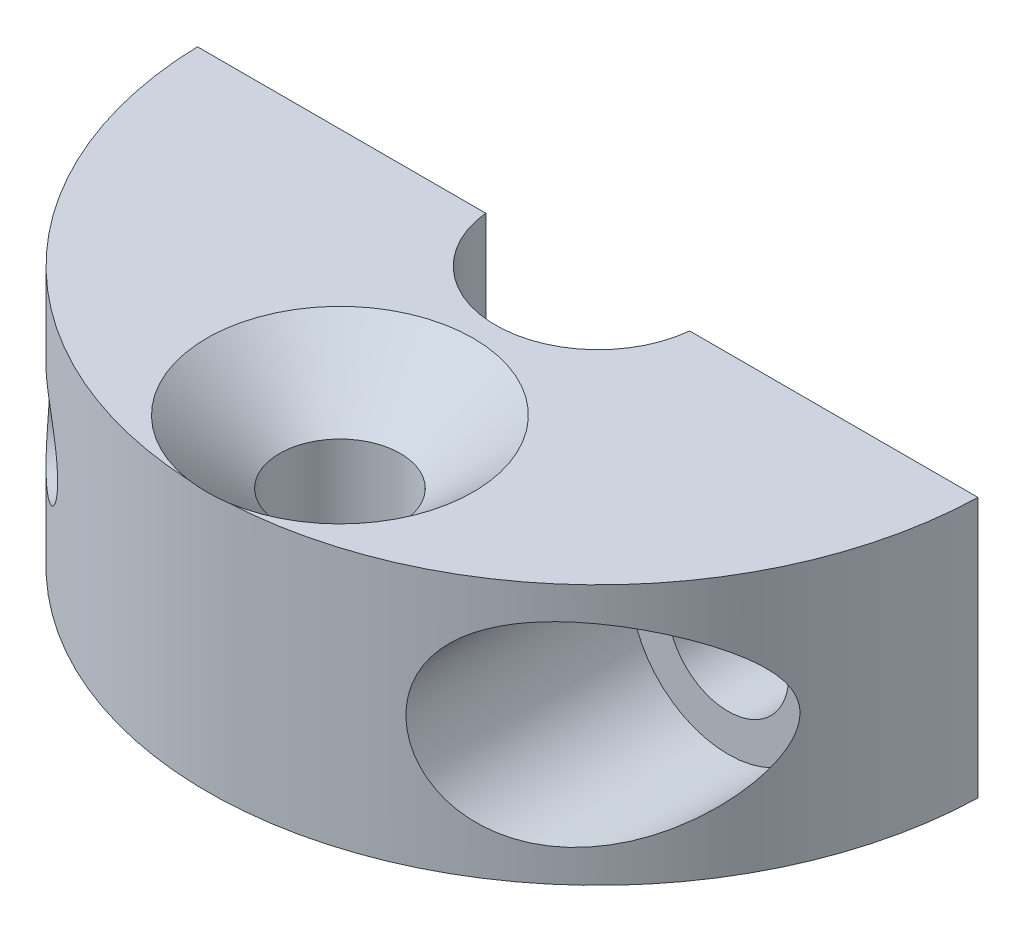
ISO-10303-21;
HEADER;
FILE_DESCRIPTION(('STEP AP214'),'2;1');
FILE_NAME('part.step','',(''),(''),'','','');
FILE_SCHEMA(('AUTOMOTIVE_DESIGN { 1 0 10303 214 1 1 1 1 }'));
ENDSEC;
DATA;
#1=APPLICATION_CONTEXT('core data for automotive mechanical design processes');
#2=APPLICATION_PROTOCOL_DEFINITION('international standard','automotive_design',2000,#1);
#3=PRODUCT_CONTEXT('',#1,'mechanical');
#4=PRODUCT('Part','Part','',(#3));
#5=PRODUCT_RELATED_PRODUCT_CATEGORY('part','',(#4));
#6=PRODUCT_DEFINITION_FORMATION('','',#4);
#7=PRODUCT_DEFINITION_CONTEXT('part definition',#1,'design');
#8=PRODUCT_DEFINITION('design','',#6,#7);
#9=PRODUCT_DEFINITION_SHAPE('','',#8);
#10=(LENGTH_UNIT() NAMED_UNIT(*) SI_UNIT(.MILLI.,.METRE.));
#11=(NAMED_UNIT(*) PLANE_ANGLE_UNIT() SI_UNIT($,.RADIAN.));
#12=(NAMED_UNIT(*) SI_UNIT($,.STERADIAN.) SOLID_ANGLE_UNIT());
#13=UNCERTAINTY_MEASURE_WITH_UNIT(LENGTH_MEASURE(1.E-05),#10,'distance_accuracy_value','');
#14=(GEOMETRIC_REPRESENTATION_CONTEXT(3) GLOBAL_UNCERTAINTY_ASSIGNED_CONTEXT((#13)) GLOBAL_UNIT_ASSIGNED_CONTEXT((#10,
#11,#12)) REPRESENTATION_CONTEXT('',''));
#15=CARTESIAN_POINT('',(0.,0.,0.));
#16=DIRECTION('',(0.,0.,1.));
#17=DIRECTION('',(1.,0.,0.));
#18=AXIS2_PLACEMENT_3D('',#15,#16,#17);
#19=CARTESIAN_POINT('',(0.,6.35,0.254));
#20=DIRECTION('',(0.,0.,-1.));
#21=DIRECTION('',(-1.,0.,0.));
#22=AXIS2_PLACEMENT_3D('',#19,#20,#21);
#23=PLANE('',#22);
#24=CARTESIAN_POINT('',(-6.35,3.175,0.253999999999998));
#25=DIRECTION('',(0.,0.,-1.));
#26=DIRECTION('',(-1.,0.,0.));
#27=AXIS2_PLACEMENT_3D('',#24,#25,#26);
#28=CIRCLE('',#27,1.13029999999999);
#29=CARTESIAN_POINT('',(-7.48029999999999,3.175,0.253999999999998));
#30=VERTEX_POINT('',#29);
#31=EDGE_CURVE('E129',#30,#30,#28,.T.);
#32=ORIENTED_EDGE('',*,*,#31,.F.);
#33=EDGE_LOOP('',(#32));
#34=FACE_BOUND('',#33,.T.);
#35=DIRECTION('',(1.,0.,0.));
#36=VECTOR('',#35,1.);
#37=CARTESIAN_POINT('',(0.,0.,0.254));
#38=LINE('',#37,#36);
#39=CARTESIAN_POINT('',(-9.52161273104509,0.,0.254));
#40=VERTEX_POINT('',#39);
#41=CARTESIAN_POINT('',(-2.48706332850613,0.,0.254));
#42=VERTEX_POINT('',#41);
#43=EDGE_CURVE('E88',#40,#42,#38,.T.);
#44=ORIENTED_EDGE('',*,*,#43,.F.);
#45=DIRECTION('',(0.,-1.,0.));
#46=VECTOR('',#45,1.);
#47=CARTESIAN_POINT('',(-9.52161273104509,6.35,0.254));
#48=LINE('',#47,#46);
#49=CARTESIAN_POINT('',(-9.52161273104509,6.35,0.254));
#50=VERTEX_POINT('',#49);
#51=EDGE_CURVE('E83',#50,#40,#48,.T.);
#52=ORIENTED_EDGE('',*,*,#51,.F.);
#53=DIRECTION('',(1.,0.,0.));
#54=VECTOR('',#53,1.);
#55=CARTESIAN_POINT('',(0.,6.35,0.254));
#56=LINE('',#55,#54);
#57=CARTESIAN_POINT('',(-2.48706332850613,6.35,0.254));
#58=VERTEX_POINT('',#57);
#59=EDGE_CURVE('E85',#50,#58,#56,.T.);
#60=ORIENTED_EDGE('',*,*,#59,.T.);
#61=DIRECTION('',(0.,-1.,0.));
#62=VECTOR('',#61,1.);
#63=CARTESIAN_POINT('',(-2.48706332850613,6.35,0.254));
#64=LINE('',#63,#62);
#65=EDGE_CURVE('E112',#58,#42,#64,.T.);
#66=ORIENTED_EDGE('',*,*,#65,.T.);
#67=EDGE_LOOP('',(#44,#52,#60,#66));
#68=FACE_BOUND('',#67,.T.);
#69=ADVANCED_FACE('F34',(#34,#68),#23,.T.);
#70=CARTESIAN_POINT('',(0.,6.35,0.));
#71=DIRECTION('',(0.,-1.,0.));
#72=DIRECTION('',(0.,0.,-1.));
#73=AXIS2_PLACEMENT_3D('',#70,#71,#72);
#74=CYLINDRICAL_SURFACE('',#73,9.525);
#75=CARTESIAN_POINT('',(8.73125,3.175,3.80669127162947));
#76=CARTESIAN_POINT('',(8.73124585906262,3.11380274599718,3.80670249167699));
#77=CARTESIAN_POINT('',(8.72886012086863,3.05255860385612,3.8121871287378));
#78=CARTESIAN_POINT('',(8.71961189124467,2.93217450298505,3.83329025284248));
#79=CARTESIAN_POINT('',(8.71274014123032,2.87303916335728,3.84892969781852));
#80=CARTESIAN_POINT('',(8.69247941509186,2.74031642023187,3.89451082973297));
#81=CARTESIAN_POINT('',(8.67772651086615,2.66797118569365,3.9273913444508));
#82=CARTESIAN_POINT('',(8.64326647717071,2.52971364812622,4.00265921990601));
#83=CARTESIAN_POINT('',(8.62354606962987,2.46381925430396,4.04507202705856));
#84=CARTESIAN_POINT('',(8.58194034360545,2.34279933963332,4.13256522289036));
#85=CARTESIAN_POINT('',(8.56033976584612,2.28723517281762,4.17718676075458));
#86=CARTESIAN_POINT('',(8.51438406626409,2.18042647889881,4.27007942896299));
#87=CARTESIAN_POINT('',(8.49002654420177,2.12918578467373,4.31835372714993));
#88=CARTESIAN_POINT('',(8.43885987449998,2.03039737946162,4.41750940373829));
#89=CARTESIAN_POINT('',(8.41204591082429,1.98285727631924,4.46839581367708));
#90=CARTESIAN_POINT('',(8.35621302061041,1.89112262737687,4.57195774228212));
#91=CARTESIAN_POINT('',(8.32719330508891,1.84692929008482,4.62463389736762));
#92=CARTESIAN_POINT('',(8.2404166552828,1.72365201522633,4.77854204058472));
#93=CARTESIAN_POINT('',(8.1800128267769,1.64841149762572,4.88137696894751));
#94=CARTESIAN_POINT('',(8.05235218932252,1.50724919354207,5.08922110982695));
#95=CARTESIAN_POINT('',(7.98509022960663,1.44133450121234,5.1942319086533));
#96=CARTESIAN_POINT('',(7.84387363125929,1.31826281768241,5.40512670932795));
#97=CARTESIAN_POINT('',(7.769910458926,1.26111725014447,5.51101166397504));
#98=CARTESIAN_POINT('',(7.61551313897524,1.15570256607707,5.72247580502464));
#99=CARTESIAN_POINT('',(7.5350791861827,1.10743318244348,5.82805500053399));
#100=CARTESIAN_POINT('',(7.36503906365976,1.01871833034591,6.04161207806623));
#101=CARTESIAN_POINT('',(7.27521448090222,0.978593297000625,6.14955005748118));
#102=CARTESIAN_POINT('',(7.08900687686002,0.909145670385695,6.36330911966715));
#103=CARTESIAN_POINT('',(6.99262205305856,0.879826060365894,6.46912961020983));
#104=CARTESIAN_POINT('',(6.79405082165952,0.833305552602271,6.67735856479362));
#105=CARTESIAN_POINT('',(6.69188371868746,0.816066635450057,6.77977675807698));
#106=CARTESIAN_POINT('',(6.48230300007768,0.795098780233277,6.98043051873497));
#107=CARTESIAN_POINT('',(6.37489340880526,0.791359639451975,7.07866918934792));
#108=CARTESIAN_POINT('',(6.13197538862243,0.799997948644437,7.29080237684964));
#109=CARTESIAN_POINT('',(5.99545094973052,0.816071247504053,7.40343391903308));
#110=CARTESIAN_POINT('',(5.71986642007338,0.874335798460531,7.61834490877518));
#111=CARTESIAN_POINT('',(5.58080983450057,0.916493268147632,7.72063754752956));
#112=CARTESIAN_POINT('',(5.32740714199558,1.02085690299249,7.89710842656864));
#113=CARTESIAN_POINT('',(5.212641016834,1.07882078235369,7.97317226827228));
#114=CARTESIAN_POINT('',(4.98950349468955,1.21629028772849,8.11467244069007));
#115=CARTESIAN_POINT('',(4.88113052860474,1.29579060094561,8.18011138608775));
#116=CARTESIAN_POINT('',(4.67530866171848,1.47657997420088,8.29948117455004));
#117=CARTESIAN_POINT('',(4.57793400105917,1.57800503549653,8.35333579853252));
#118=CARTESIAN_POINT('',(4.40049844184197,1.80023770574852,8.44815969502052));
#119=CARTESIAN_POINT('',(4.32042877505943,1.92103544450288,8.48913549786795));
#120=CARTESIAN_POINT('',(4.19061716402563,2.16305355555541,8.55388859931293));
#121=CARTESIAN_POINT('',(4.13842604105973,2.28257850762935,8.57911517651567));
#122=CARTESIAN_POINT('',(4.05401892692662,2.53010112829094,8.61932502802954));
#123=CARTESIAN_POINT('',(4.02179474444212,2.6580952985495,8.63431250312991));
#124=CARTESIAN_POINT('',(3.98030162898478,2.91012756038926,8.65351431952956));
#125=CARTESIAN_POINT('',(3.9697072091351,3.03390221400917,8.65835127039265));
#126=CARTESIAN_POINT('',(3.96791765661135,3.28161106762906,8.65917197988703));
#127=CARTESIAN_POINT('',(3.97671907136452,3.40554523530985,8.65515731415811));
#128=CARTESIAN_POINT('',(4.0130215187815,3.64792226994344,8.63838326555925));
#129=CARTESIAN_POINT('',(4.04021217484417,3.76642196060128,8.62576900020099));
#130=CARTESIAN_POINT('',(4.11179310891203,3.99678372543352,8.59187630600988));
#131=CARTESIAN_POINT('',(4.15618287617765,4.10864599659698,8.57059813445679));
#132=CARTESIAN_POINT('',(4.26086419795659,4.32407395429554,8.51904254560431));
#133=CARTESIAN_POINT('',(4.32133412902925,4.42752842960967,8.48866366377713));
#134=CARTESIAN_POINT('',(4.45533724770527,4.62226763054796,8.41910199510069));
#135=CARTESIAN_POINT('',(4.52887201628935,4.71355088098503,8.37991814260663));
#136=CARTESIAN_POINT('',(4.68967520458576,4.88620623020625,8.29104170582099));
#137=CARTESIAN_POINT('',(4.77742189145047,4.96692366723649,8.24094653064745));
#138=CARTESIAN_POINT('',(4.96044679236488,5.11231007852109,8.13209269583887));
#139=CARTESIAN_POINT('',(5.05572697275969,5.17697484445427,8.07333177083856));
#140=CARTESIAN_POINT('',(5.26043691729229,5.29599288241576,7.94164236856519));
#141=CARTESIAN_POINT('',(5.37032121744672,5.3486331353757,7.86788123443396));
#142=CARTESIAN_POINT('',(5.59162261419243,5.43539066226963,7.7121793386027));
#143=CARTESIAN_POINT('',(5.70304085466794,5.46949324892478,7.63023215181272));
#144=CARTESIAN_POINT('',(5.89509506245812,5.51388630770408,7.48224930743032));
#145=CARTESIAN_POINT('',(5.97605793436485,5.5280933617614,7.41775772611152));
#146=CARTESIAN_POINT('',(6.13645657545348,5.54803264694833,7.28562597510152));
#147=CARTESIAN_POINT('',(6.21589177934332,5.55376179831821,7.21798467041255));
#148=CARTESIAN_POINT('',(6.45104510570492,5.55927014275432,7.01092802191453));
#149=CARTESIAN_POINT('',(6.60356319311729,5.54736016486058,6.86741666472369));
#150=CARTESIAN_POINT('',(6.84688207474141,5.50590938017747,6.62305380134368));
#151=CARTESIAN_POINT('',(6.94111904288746,5.48368843383567,6.5241785701631));
#152=CARTESIAN_POINT('',(7.1239281214786,5.42899197284371,6.32404886699402));
#153=CARTESIAN_POINT('',(7.21250100782499,5.39651786636966,6.22279472349348));
#154=CARTESIAN_POINT('',(7.38404496573302,5.322065410151,6.01825695280595));
#155=CARTESIAN_POINT('',(7.46698946263312,5.28004556448929,5.91496631849497));
#156=CARTESIAN_POINT('',(7.62666648638895,5.18721292272886,5.70760009762724));
#157=CARTESIAN_POINT('',(7.70340074392202,5.13640258884557,5.6035247386583));
#158=CARTESIAN_POINT('',(7.85225788367841,5.0249783674519,5.39301985487657));
#159=CARTESIAN_POINT('',(7.92423346499236,4.96416528440563,5.2865914339636));
#160=CARTESIAN_POINT('',(8.06147425772619,4.83337456723039,5.0748586875616));
#161=CARTESIAN_POINT('',(8.12673302240567,4.76338827250192,4.96955552735754));
#162=CARTESIAN_POINT('',(8.24975947065343,4.61395533302383,4.76250463073511));
#163=CARTESIAN_POINT('',(8.30757450241503,4.53457535171027,4.66073777172056));
#164=CARTESIAN_POINT('',(8.38845148873899,4.40690305325763,4.51250358103415));
#165=CARTESIAN_POINT('',(8.41441736044993,4.36295137225293,4.46386619855724));
#166=CARTESIAN_POINT('',(8.46425741272757,4.27179880901778,4.36862144136794));
#167=CARTESIAN_POINT('',(8.48813236718617,4.22459914058432,4.32201331882359));
#168=CARTESIAN_POINT('',(8.5375193683617,4.11794543836625,4.22373173923698));
#169=CARTESIAN_POINT('',(8.56259233564551,4.05778884789023,4.17258985309526));
#170=CARTESIAN_POINT('',(8.6089039730595,3.93145702016769,4.07618063280652));
#171=CARTESIAN_POINT('',(8.6301434178134,3.86528300291035,4.03091211237422));
#172=CARTESIAN_POINT('',(8.66464794919427,3.73748861662883,3.95612379377573));
#173=CARTESIAN_POINT('',(8.67864844128649,3.67688249755383,3.9252397916889));
#174=CARTESIAN_POINT('',(8.70223828487597,3.55101607391536,3.87266227107456));
#175=CARTESIAN_POINT('',(8.7118405857566,3.48577009420702,3.85094178793825));
#176=CARTESIAN_POINT('',(8.72283111197797,3.37903663695091,3.82595679090265));
#177=CARTESIAN_POINT('',(8.72597110304145,3.33863446727312,3.81878014864618));
#178=CARTESIAN_POINT('',(8.73018179816117,3.25716185129037,3.80914393925489));
#179=CARTESIAN_POINT('',(8.73125278047296,3.21609149559729,3.80668373781867));
#180=CARTESIAN_POINT('',(8.73125,3.175,3.80669127162947));
#181=B_SPLINE_CURVE_WITH_KNOTS('',3,(#75,#76,#77,#78,#79,#80,#81,#82,#83,#84,#85,#86,#87,#88,
#89,#90,#91,#92,#93,#94,#95,#96,#97,#98,#99,#100,#101,#102,#103,#104,#105,#106,#107,#108,#109,
#110,#111,#112,#113,#114,#115,#116,#117,#118,#119,#120,#121,#122,#123,#124,#125,#126,#127,#128,
#129,#130,#131,#132,#133,#134,#135,#136,#137,#138,#139,#140,#141,#142,#143,#144,#145,#146,#147,
#148,#149,#150,#151,#152,#153,#154,#155,#156,#157,#158,#159,#160,#161,#162,#163,#164,#165,#166,
#167,#168,#169,#170,#171,#172,#173,#174,#175,#176,#177,#178,#179,#180),.UNSPECIFIED.,.T.,.F.,(4,
2,2,2,2,2,2,2,2,2,2,2,2,2,2,2,2,2,2,2,2,2,2,2,2,2,2,2,2,2,2,2,2,2,2,2,2,2,2,2,2,2,2,2,2,2,2,2,2,
2,2,2,4),(0.,0.183408128001872,0.367195989984928,0.6082825935503,0.850020586537929,
1.07309273515017,1.2963606098481,1.52007598912572,1.74387176998692,2.16628460746682,
2.58901706625187,3.01229563303332,3.4355614603357,3.87316580365065,4.31089087401054,
4.74723210768626,5.18324349893373,5.71442165334505,6.24491329849377,6.69123507646677,
7.13744685197283,7.58651029298663,8.03534566292523,8.43178676849444,8.82806512861671,
9.19922676798423,9.57032234373145,9.935305849994,10.300278518648,10.6694821441641,
11.0387304776123,11.4250768675877,11.8115244342932,12.237199888928,12.6632121138501,
12.9762399761009,13.2893815237972,13.9158455682097,14.3305648444897,14.7452271876953,
15.1617278087596,15.5781119563363,16.0041059983624,16.4305051659394,16.8540418249594,
17.0654644304143,17.2768084503137,17.5249610095374,17.7730633693461,17.9807495864019,
18.1878203289425,18.3109880785428,18.4341392624823),.UNSPECIFIED.);
#182=CARTESIAN_POINT('',(8.73125,3.175,3.80669127162947));
#183=VERTEX_POINT('',#182);
#184=EDGE_CURVE('E130',#183,#183,#181,.T.);
#185=ORIENTED_EDGE('',*,*,#184,.T.);
#186=EDGE_LOOP('',(#185));
#187=FACE_BOUND('',#186,.T.);
#188=CARTESIAN_POINT('',(-7.48029999999999,3.175,5.89667168070261));
#189=CARTESIAN_POINT('',(-7.48029565134748,3.22259997865436,5.89667785938464));
#190=CARTESIAN_POINT('',(-7.47725373029182,3.27029460330494,5.90054233883782));
#191=CARTESIAN_POINT('',(-7.46541737064039,3.36385112501171,5.91550946883295));
#192=CARTESIAN_POINT('',(-7.4566042783128,3.40970656559901,5.92663559025681));
#193=CARTESIAN_POINT('',(-7.43419805916005,3.49769606241299,5.95471559179193));
#194=CARTESIAN_POINT('',(-7.42065982635289,3.53986618237576,5.97160249753332));
#195=CARTESIAN_POINT('',(-7.38969835897306,3.62050453125606,6.00987447517193));
#196=CARTESIAN_POINT('',(-7.37227476339603,3.65897241570854,6.03125996503986));
#197=CARTESIAN_POINT('',(-7.32330545247409,3.75335773161245,6.09073262302534));
#198=CARTESIAN_POINT('',(-7.28942435852832,3.80648143117371,6.13132047002174));
#199=CARTESIAN_POINT('',(-7.21598291712453,3.90396591902674,6.21759284087839));
#200=CARTESIAN_POINT('',(-7.17640620253685,3.94830054648356,6.26329196532406));
#201=CARTESIAN_POINT('',(-7.07417500170896,4.04690126972761,6.37886774294738));
#202=CARTESIAN_POINT('',(-7.00912034930138,4.09672943041199,6.45041006663986));
#203=CARTESIAN_POINT('',(-6.87221976537053,4.18063869384731,6.59607975688559));
#204=CARTESIAN_POINT('',(-6.80036780368582,4.21470565339485,6.67020938124574));
#205=CARTESIAN_POINT('',(-6.64973223464145,4.26781990788574,6.82042864157201));
#206=CARTESIAN_POINT('',(-6.5708285718829,4.28650991168471,6.89652467378962));
#207=CARTESIAN_POINT('',(-6.40924631309905,4.30667319244828,7.04693816828336));
#208=CARTESIAN_POINT('',(-6.32657111297204,4.30816166209146,7.12125714217254));
#209=CARTESIAN_POINT('',(-6.17318503114178,4.29359295446744,7.25437874473316));
#210=CARTESIAN_POINT('',(-6.10270197504243,4.28033486307525,7.31374672008633));
#211=CARTESIAN_POINT('',(-5.96259537535977,4.23933445223775,7.42840712304612));
#212=CARTESIAN_POINT('',(-5.89297094307677,4.21160867149824,7.48370412218939));
#213=CARTESIAN_POINT('',(-5.7711269933729,4.14773411332157,7.57788967093766));
#214=CARTESIAN_POINT('',(-5.71823729753289,4.11442661152434,7.61783380833057));
#215=CARTESIAN_POINT('',(-5.6167258139703,4.0375130876086,7.69298299861591));
#216=CARTESIAN_POINT('',(-5.56809925085041,3.99391879585619,7.72819337830193));
#217=CARTESIAN_POINT('',(-5.48475360151541,3.90441319011294,7.78750894268825));
#218=CARTESIAN_POINT('',(-5.44905506924706,3.8599974432931,7.81248947464876));
#219=CARTESIAN_POINT('',(-5.38389683741567,3.76453924909285,7.85753455175028));
#220=CARTESIAN_POINT('',(-5.35443535676979,3.71349870025736,7.87760050058114));
#221=CARTESIAN_POINT('',(-5.3031888519246,3.60552843558124,7.91219197263669));
#222=CARTESIAN_POINT('',(-5.28145021581632,3.54856570330972,7.92668405741647));
#223=CARTESIAN_POINT('',(-5.24730013262282,3.43070952947367,7.94933295442878));
#224=CARTESIAN_POINT('',(-5.2348835242573,3.36981828330087,7.9574932724228));
#225=CARTESIAN_POINT('',(-5.2210274879492,3.25298340152351,7.96658994873813));
#226=CARTESIAN_POINT('',(-5.21854917736117,3.19721385736522,7.9682101108825));
#227=CARTESIAN_POINT('',(-5.22183657147574,3.08603437999955,7.9660562805255));
#228=CARTESIAN_POINT('',(-5.2275996237375,3.0306243368535,7.96228402354703));
#229=CARTESIAN_POINT('',(-5.24662268756084,2.92411493211032,7.94976070920659));
#230=CARTESIAN_POINT('',(-5.25956160511669,2.87293210879645,7.94122279854199));
#231=CARTESIAN_POINT('',(-5.29203771326417,2.7737280931732,7.91961740086616));
#232=CARTESIAN_POINT('',(-5.3115755417484,2.7257072070532,7.9065494759518));
#233=CARTESIAN_POINT('',(-5.35739832730384,2.63169473824638,7.87557641995552));
#234=CARTESIAN_POINT('',(-5.38395452314157,2.58590101288543,7.85747480373983));
#235=CARTESIAN_POINT('',(-5.44215968934291,2.49963688096758,7.81727403189546));
#236=CARTESIAN_POINT('',(-5.47381036626703,2.45916826651332,7.79517353640435));
#237=CARTESIAN_POINT('',(-5.5450623533139,2.37948818864766,7.74467737699947));
#238=CARTESIAN_POINT('',(-5.58516162421479,2.34100047042069,7.71584545185329));
#239=CARTESIAN_POINT('',(-5.66882265400507,2.27137157724344,7.65459168833019));
#240=CARTESIAN_POINT('',(-5.71238682150587,2.24023557354917,7.62216734643324));
#241=CARTESIAN_POINT('',(-5.82132868093059,2.17311284946938,7.53951087715701));
#242=CARTESIAN_POINT('',(-5.88789902484792,2.14098045775455,7.48770204357223));
#243=CARTESIAN_POINT('',(-6.02274134001643,2.09071272008816,7.37968327661476));
#244=CARTESIAN_POINT('',(-6.09101617832748,2.07260286436494,7.3234655319641));
#245=CARTESIAN_POINT('',(-6.24354773376253,2.04646834467586,7.19416089383022));
#246=CARTESIAN_POINT('',(-6.32770862847155,2.04190595976111,7.12026284952699));
#247=CARTESIAN_POINT('',(-6.49285505446183,2.05071131000968,6.9700049600719));
#248=CARTESIAN_POINT('',(-6.57383682342241,2.06409966738305,6.89364238202145));
#249=CARTESIAN_POINT('',(-6.73152601204655,2.10786246588183,6.73976588997081));
#250=CARTESIAN_POINT('',(-6.80818256893842,2.13840548886131,6.66224810021571));
#251=CARTESIAN_POINT('',(-6.95460356238348,2.2164007890815,6.50924452786639));
#252=CARTESIAN_POINT('',(-7.02437718172069,2.26383013708617,6.43375613839644));
#253=CARTESIAN_POINT('',(-7.13241515472719,2.35731328211955,6.31335368238039));
#254=CARTESIAN_POINT('',(-7.17329114273254,2.39828322711932,6.26681720888878));
#255=CARTESIAN_POINT('',(-7.25000154055208,2.48864647106294,6.17790570014908));
#256=CARTESIAN_POINT('',(-7.28584411481468,2.53802583470138,6.13552396024201));
#257=CARTESIAN_POINT('',(-7.34173184840844,2.63084284405894,6.06843894168925));
#258=CARTESIAN_POINT('',(-7.36339751348895,2.67211023996567,6.04209807358577));
#259=CARTESIAN_POINT('',(-7.40222463318467,2.7594576551109,5.99446716075086));
#260=CARTESIAN_POINT('',(-7.41939158564537,2.80553170293883,5.97317095406197));
#261=CARTESIAN_POINT('',(-7.44501505197191,2.89196216330118,5.94118743226586));
#262=CARTESIAN_POINT('',(-7.45453966878987,2.93152263077889,5.92921589506632));
#263=CARTESIAN_POINT('',(-7.46932522408409,3.01259886726973,5.91057956926923));
#264=CARTESIAN_POINT('',(-7.47459814962012,3.05410878742843,5.90389986202147));
#265=CARTESIAN_POINT('',(-7.47845487751502,3.1091052235515,5.89901167345971));
#266=CARTESIAN_POINT('',(-7.47914552818821,3.12225650251767,5.89813597540983));
#267=CARTESIAN_POINT('',(-7.4800687385517,3.14860275518593,5.89696506381856));
#268=CARTESIAN_POINT('',(-7.48030120613611,3.16179773713948,5.89666996699208));
#269=CARTESIAN_POINT('',(-7.48029999999999,3.175,5.89667168070261));
#270=B_SPLINE_CURVE_WITH_KNOTS('',3,(#188,#189,#190,#191,#192,#193,#194,#195,#196,#197,#198,
#199,#200,#201,#202,#203,#204,#205,#206,#207,#208,#209,#210,#211,#212,#213,#214,#215,#216,#217,
#218,#219,#220,#221,#222,#223,#224,#225,#226,#227,#228,#229,#230,#231,#232,#233,#234,#235,#236,
#237,#238,#239,#240,#241,#242,#243,#244,#245,#246,#247,#248,#249,#250,#251,#252,#253,#254,#255,
#256,#257,#258,#259,#260,#261,#262,#263,#264,#265,#266,#267,#268,#269),.UNSPECIFIED.,.T.,.F.,(4,
2,2,2,2,2,2,2,2,2,2,2,2,2,2,2,2,2,2,2,2,2,2,2,2,2,2,2,2,2,2,2,2,2,2,2,2,2,2,2,4),(0.,
0.142730459234148,0.285924547971483,0.427507610508392,0.569103833570638,0.792689534639627,
1.01693106727165,1.34155068823269,1.66646104203532,1.99872313364342,2.330691743443,
2.60896403351743,2.88691891189796,3.10860647869452,3.33004245920794,3.51592866294237,
3.70176171228946,3.88869283116746,4.07552037635113,4.24221164819338,4.40884928336801,
4.5685705210839,4.72830720288897,4.89546331386334,5.06267553614141,5.24980241012812,
5.4370605211506,5.70638515887723,5.9761982341884,6.31074784383847,6.64568212098566,
6.98396693998715,7.32179415712702,7.54401093340969,7.76586299342307,7.92598027566477,
8.08590095739198,8.21265506276173,8.33905054037469,8.3786301033499,8.41821762196402),.UNSPECIFIED.);
#271=CARTESIAN_POINT('',(-7.48029999999999,3.175,5.89667168070261));
#272=VERTEX_POINT('',#271);
#273=EDGE_CURVE('E120',#272,#272,#270,.T.);
#274=ORIENTED_EDGE('',*,*,#273,.T.);
#275=EDGE_LOOP('',(#274));
#276=FACE_BOUND('',#275,.T.);
#277=CARTESIAN_POINT('',(0.,6.35,0.));
#278=DIRECTION('',(0.,1.,0.));
#279=DIRECTION('',(0.,0.,1.));
#280=AXIS2_PLACEMENT_3D('',#277,#278,#279);
#281=CIRCLE('',#280,9.525);
#282=CARTESIAN_POINT('',(0.498591302475483,6.35,9.51194153225806));
#283=VERTEX_POINT('',#282);
#284=CARTESIAN_POINT('',(9.52161273104509,6.35,0.254));
#285=VERTEX_POINT('',#284);
#286=EDGE_CURVE('E98',#283,#285,#281,.T.);
#287=ORIENTED_EDGE('',*,*,#286,.F.);
#288=CARTESIAN_POINT('',(0.498591302475483,6.35,9.51194153225806));
#289=CARTESIAN_POINT('',(0.332394201650322,6.33528007790631,9.52064717741935));
#290=CARTESIAN_POINT('',(0.166197100825161,6.32792011685946,9.525));
#291=CARTESIAN_POINT('',(-0.166197100825161,6.32792011685946,9.525));
#292=CARTESIAN_POINT('',(-0.332394201650322,6.33528007790631,9.52064717741935));
#293=CARTESIAN_POINT('',(-0.498591302475483,6.35,9.51194153225806));
#294=B_SPLINE_CURVE_WITH_KNOTS('',3,(#288,#289,#290,#291,#292,#293),.UNSPECIFIED.,.F.,.F.,(4,2,
4),(0.,0.49925077037844,0.99850154075688),.UNSPECIFIED.);
#295=CARTESIAN_POINT('',(-0.498591302475483,6.35,9.51194153225806));
#296=VERTEX_POINT('',#295);
#297=EDGE_CURVE('E11',#283,#296,#294,.T.);
#298=ORIENTED_EDGE('',*,*,#297,.T.);
#299=EDGE_CURVE('E94',#50,#296,#281,.T.);
#300=ORIENTED_EDGE('',*,*,#299,.F.);
#301=ORIENTED_EDGE('',*,*,#51,.T.);
#302=CARTESIAN_POINT('',(0.,0.,0.));
#303=DIRECTION('',(0.,1.,0.));
#304=DIRECTION('',(0.,0.,1.));
#305=AXIS2_PLACEMENT_3D('',#302,#303,#304);
#306=CIRCLE('',#305,9.525);
#307=CARTESIAN_POINT('',(9.52161273104509,0.,0.254));
#308=VERTEX_POINT('',#307);
#309=EDGE_CURVE('E119',#40,#308,#306,.T.);
#310=ORIENTED_EDGE('',*,*,#309,.T.);
#311=DIRECTION('',(0.,-1.,0.));
#312=VECTOR('',#311,1.);
#313=CARTESIAN_POINT('',(9.52161273104509,6.35,0.254));
#314=LINE('',#313,#312);
#315=EDGE_CURVE('E92',#285,#308,#314,.T.);
#316=ORIENTED_EDGE('',*,*,#315,.F.);
#317=EDGE_LOOP('',(#287,#298,#300,#301,#310,#316));
#318=FACE_BOUND('',#317,.T.);
#319=ADVANCED_FACE('F95',(#187,#276,#318),#74,.T.);
#320=CARTESIAN_POINT('',(6.35,3.175,0.253999999999999));
#321=DIRECTION('',(0.,0.,1.));
#322=DIRECTION('',(1.,0.,0.));
#323=AXIS2_PLACEMENT_3D('',#320,#321,#322);
#324=CIRCLE('',#323,1.4732);
#325=CARTESIAN_POINT('',(7.8232,3.175,0.253999999999999));
#326=VERTEX_POINT('',#325);
#327=EDGE_CURVE('E176',#326,#326,#324,.T.);
#328=ORIENTED_EDGE('',*,*,#327,.T.);
#329=EDGE_LOOP('',(#328));
#330=FACE_BOUND('',#329,.T.);
#331=CARTESIAN_POINT('',(2.48706332850613,0.,0.254));
#332=VERTEX_POINT('',#331);
#333=EDGE_CURVE('E107',#332,#308,#38,.T.);
#334=ORIENTED_EDGE('',*,*,#333,.F.);
#335=DIRECTION('',(0.,-1.,0.));
#336=VECTOR('',#335,1.);
#337=CARTESIAN_POINT('',(2.48706332850613,6.35,0.254));
#338=LINE('',#337,#336);
#339=CARTESIAN_POINT('',(2.48706332850613,6.35,0.254));
#340=VERTEX_POINT('',#339);
#341=EDGE_CURVE('E115',#340,#332,#338,.T.);
#342=ORIENTED_EDGE('',*,*,#341,.F.);
#343=EDGE_CURVE('E97',#340,#285,#56,.T.);
#344=ORIENTED_EDGE('',*,*,#343,.T.);
#345=ORIENTED_EDGE('',*,*,#315,.T.);
#346=EDGE_LOOP('',(#334,#342,#344,#345));
#347=FACE_BOUND('',#346,.T.);
#348=ADVANCED_FACE('F153',(#330,#347),#23,.T.);
#349=CARTESIAN_POINT('',(0.,6.35,0.));
#350=DIRECTION('',(0.,-1.,0.));
#351=DIRECTION('',(0.,0.,-1.));
#352=AXIS2_PLACEMENT_3D('',#349,#350,#351);
#353=CYLINDRICAL_SURFACE('',#352,2.5);
#354=CARTESIAN_POINT('',(0.,0.,0.));
#355=DIRECTION('',(0.,1.,0.));
#356=DIRECTION('',(0.,0.,1.));
#357=AXIS2_PLACEMENT_3D('',#354,#355,#356);
#358=CIRCLE('',#357,2.5);
#359=EDGE_CURVE('E104',#42,#332,#358,.T.);
#360=ORIENTED_EDGE('',*,*,#359,.F.);
#361=ORIENTED_EDGE('',*,*,#65,.F.);
#362=CARTESIAN_POINT('',(0.,6.35,0.));
#363=DIRECTION('',(0.,1.,0.));
#364=DIRECTION('',(0.,0.,1.));
#365=AXIS2_PLACEMENT_3D('',#362,#363,#364);
#366=CIRCLE('',#365,2.5);
#367=EDGE_CURVE('E103',#58,#340,#366,.T.);
#368=ORIENTED_EDGE('',*,*,#367,.T.);
#369=ORIENTED_EDGE('',*,*,#341,.T.);
#370=EDGE_LOOP('',(#360,#361,#368,#369));
#371=FACE_BOUND('',#370,.T.);
#372=ADVANCED_FACE('F148',(#371),#353,.F.);
#373=CARTESIAN_POINT('',(0.,6.35,0.));
#374=DIRECTION('',(0.,1.,0.));
#375=DIRECTION('',(0.,0.,1.));
#376=AXIS2_PLACEMENT_3D('',#373,#374,#375);
#377=PLANE('',#376);
#378=ORIENTED_EDGE('',*,*,#299,.T.);
#379=CARTESIAN_POINT('',(0.,6.35,6.2992));
#380=DIRECTION('',(0.,1.,0.));
#381=DIRECTION('',(0.,0.,1.));
#382=AXIS2_PLACEMENT_3D('',#379,#380,#381);
#383=CIRCLE('',#382,3.25120000000001);
#384=EDGE_CURVE('E46',#296,#283,#383,.F.);
#385=ORIENTED_EDGE('',*,*,#384,.T.);
#386=ORIENTED_EDGE('',*,*,#286,.T.);
#387=ORIENTED_EDGE('',*,*,#343,.F.);
#388=ORIENTED_EDGE('',*,*,#367,.F.);
#389=ORIENTED_EDGE('',*,*,#59,.F.);
#390=EDGE_LOOP('',(#378,#385,#386,#387,#388,#389));
#391=FACE_BOUND('',#390,.T.);
#392=ADVANCED_FACE('F100',(#391),#377,.T.);
#393=CARTESIAN_POINT('',(0.,0.,0.));
#394=DIRECTION('',(0.,1.,0.));
#395=DIRECTION('',(0.,0.,1.));
#396=AXIS2_PLACEMENT_3D('',#393,#394,#395);
#397=PLANE('',#396);
#398=CARTESIAN_POINT('',(0.,0.,6.2992));
#399=DIRECTION('',(0.,1.,0.));
#400=DIRECTION('',(0.,0.,1.));
#401=AXIS2_PLACEMENT_3D('',#398,#399,#400);
#402=CIRCLE('',#401,1.4732);
#403=CARTESIAN_POINT('',(0.,0.,7.7724));
#404=VERTEX_POINT('',#403);
#405=EDGE_CURVE('E180',#404,#404,#402,.T.);
#406=ORIENTED_EDGE('',*,*,#405,.T.);
#407=EDGE_LOOP('',(#406));
#408=FACE_BOUND('',#407,.T.);
#409=ORIENTED_EDGE('',*,*,#43,.T.);
#410=ORIENTED_EDGE('',*,*,#359,.T.);
#411=ORIENTED_EDGE('',*,*,#333,.T.);
#412=ORIENTED_EDGE('',*,*,#309,.F.);
#413=EDGE_LOOP('',(#409,#410,#411,#412));
#414=FACE_BOUND('',#413,.T.);
#415=ADVANCED_FACE('F142',(#408,#414),#397,.F.);
#416=CARTESIAN_POINT('',(-6.35,3.175,0.254));
#417=DIRECTION('',(0.,0.,-1.));
#418=DIRECTION('',(-1.,0.,0.));
#419=AXIS2_PLACEMENT_3D('',#416,#417,#418);
#420=CYLINDRICAL_SURFACE('',#419,1.13029999999999);
#421=ORIENTED_EDGE('',*,*,#31,.T.);
#422=EDGE_LOOP('',(#421));
#423=FACE_BOUND('',#422,.T.);
#424=ORIENTED_EDGE('',*,*,#273,.F.);
#425=EDGE_LOOP('',(#424));
#426=FACE_BOUND('',#425,.T.);
#427=ADVANCED_FACE('F137',(#423,#426),#420,.F.);
#428=CARTESIAN_POINT('',(6.35,3.175,3.175));
#429=DIRECTION('',(0.,0.,1.));
#430=DIRECTION('',(1.,0.,0.));
#431=AXIS2_PLACEMENT_3D('',#428,#429,#430);
#432=CYLINDRICAL_SURFACE('',#431,2.38125);
#433=CARTESIAN_POINT('',(6.35,3.175,3.175));
#434=DIRECTION('',(0.,0.,1.));
#435=DIRECTION('',(1.,0.,0.));
#436=AXIS2_PLACEMENT_3D('',#433,#434,#435);
#437=CIRCLE('',#436,2.38125);
#438=CARTESIAN_POINT('',(8.73125,3.175,3.175));
#439=VERTEX_POINT('',#438);
#440=EDGE_CURVE('E172',#439,#439,#437,.T.);
#441=ORIENTED_EDGE('',*,*,#440,.F.);
#442=EDGE_LOOP('',(#441));
#443=FACE_BOUND('',#442,.T.);
#444=ORIENTED_EDGE('',*,*,#184,.F.);
#445=EDGE_LOOP('',(#444));
#446=FACE_BOUND('',#445,.T.);
#447=ADVANCED_FACE('F141',(#443,#446),#432,.F.);
#448=CARTESIAN_POINT('',(6.35,3.175,3.175));
#449=DIRECTION('',(0.,0.,1.));
#450=DIRECTION('',(1.,0.,0.));
#451=AXIS2_PLACEMENT_3D('',#448,#449,#450);
#452=PLANE('',#451);
#453=CARTESIAN_POINT('',(6.35,3.175,3.175));
#454=DIRECTION('',(0.,0.,1.));
#455=DIRECTION('',(1.,0.,0.));
#456=AXIS2_PLACEMENT_3D('',#453,#454,#455);
#457=CIRCLE('',#456,1.4732);
#458=CARTESIAN_POINT('',(7.8232,3.175,3.175));
#459=VERTEX_POINT('',#458);
#460=EDGE_CURVE('E177',#459,#459,#457,.T.);
#461=ORIENTED_EDGE('',*,*,#460,.F.);
#462=EDGE_LOOP('',(#461));
#463=FACE_BOUND('',#462,.T.);
#464=ORIENTED_EDGE('',*,*,#440,.T.);
#465=EDGE_LOOP('',(#464));
#466=FACE_BOUND('',#465,.T.);
#467=ADVANCED_FACE('F195',(#463,#466),#452,.T.);
#468=CARTESIAN_POINT('',(6.35,3.175,0.253999999999999));
#469=DIRECTION('',(0.,0.,1.));
#470=DIRECTION('',(1.,0.,0.));
#471=AXIS2_PLACEMENT_3D('',#468,#469,#470);
#472=CYLINDRICAL_SURFACE('',#471,1.4732);
#473=CARTESIAN_POINT('',(7.8232,3.175,0.253999999999999));
#474=CARTESIAN_POINT('',(7.8232,3.175,0.284427083333332));
#475=CARTESIAN_POINT('',(7.8232,3.175,0.314854166666665));
#476=CARTESIAN_POINT('',(7.8232,3.175,0.375708333333332));
#477=CARTESIAN_POINT('',(7.8232,3.175,0.406135416666665));
#478=CARTESIAN_POINT('',(7.8232,3.175,0.466989583333332));
#479=CARTESIAN_POINT('',(7.8232,3.175,0.497416666666665));
#480=CARTESIAN_POINT('',(7.8232,3.175,0.558270833333332));
#481=CARTESIAN_POINT('',(7.8232,3.175,0.588697916666665));
#482=CARTESIAN_POINT('',(7.8232,3.175,0.649552083333332));
#483=CARTESIAN_POINT('',(7.8232,3.175,0.679979166666666));
#484=CARTESIAN_POINT('',(7.8232,3.175,0.740833333333332));
#485=CARTESIAN_POINT('',(7.8232,3.175,0.771260416666666));
#486=CARTESIAN_POINT('',(7.8232,3.175,0.832114583333332));
#487=CARTESIAN_POINT('',(7.8232,3.175,0.862541666666666));
#488=CARTESIAN_POINT('',(7.8232,3.175,0.923395833333332));
#489=CARTESIAN_POINT('',(7.8232,3.175,0.953822916666666));
#490=CARTESIAN_POINT('',(7.8232,3.175,1.01467708333333));
#491=CARTESIAN_POINT('',(7.8232,3.175,1.04510416666667));
#492=CARTESIAN_POINT('',(7.8232,3.175,1.10595833333333));
#493=CARTESIAN_POINT('',(7.8232,3.175,1.13638541666667));
#494=CARTESIAN_POINT('',(7.8232,3.175,1.19723958333333));
#495=CARTESIAN_POINT('',(7.8232,3.175,1.22766666666667));
#496=CARTESIAN_POINT('',(7.8232,3.175,1.28852083333333));
#497=CARTESIAN_POINT('',(7.8232,3.175,1.31894791666667));
#498=CARTESIAN_POINT('',(7.8232,3.175,1.37980208333333));
#499=CARTESIAN_POINT('',(7.8232,3.175,1.41022916666667));
#500=CARTESIAN_POINT('',(7.8232,3.175,1.47108333333333));
#501=CARTESIAN_POINT('',(7.8232,3.175,1.50151041666667));
#502=CARTESIAN_POINT('',(7.8232,3.175,1.56236458333333));
#503=CARTESIAN_POINT('',(7.8232,3.175,1.59279166666667));
#504=CARTESIAN_POINT('',(7.8232,3.175,1.65364583333333));
#505=CARTESIAN_POINT('',(7.8232,3.175,1.68407291666667));
#506=CARTESIAN_POINT('',(7.8232,3.175,1.74492708333333));
#507=CARTESIAN_POINT('',(7.8232,3.175,1.77535416666667));
#508=CARTESIAN_POINT('',(7.8232,3.175,1.83620833333333));
#509=CARTESIAN_POINT('',(7.8232,3.175,1.86663541666667));
#510=CARTESIAN_POINT('',(7.8232,3.175,1.92748958333333));
#511=CARTESIAN_POINT('',(7.8232,3.175,1.95791666666667));
#512=CARTESIAN_POINT('',(7.8232,3.175,2.01877083333333));
#513=CARTESIAN_POINT('',(7.8232,3.175,2.04919791666667));
#514=CARTESIAN_POINT('',(7.8232,3.175,2.11005208333333));
#515=CARTESIAN_POINT('',(7.8232,3.175,2.14047916666667));
#516=CARTESIAN_POINT('',(7.8232,3.175,2.20133333333333));
#517=CARTESIAN_POINT('',(7.8232,3.175,2.23176041666667));
#518=CARTESIAN_POINT('',(7.8232,3.175,2.29261458333333));
#519=CARTESIAN_POINT('',(7.8232,3.175,2.32304166666667));
#520=CARTESIAN_POINT('',(7.8232,3.175,2.38389583333333));
#521=CARTESIAN_POINT('',(7.8232,3.175,2.41432291666667));
#522=CARTESIAN_POINT('',(7.8232,3.175,2.47517708333333));
#523=CARTESIAN_POINT('',(7.8232,3.175,2.50560416666667));
#524=CARTESIAN_POINT('',(7.8232,3.175,2.56645833333333));
#525=CARTESIAN_POINT('',(7.8232,3.175,2.59688541666667));
#526=CARTESIAN_POINT('',(7.8232,3.175,2.65773958333333));
#527=CARTESIAN_POINT('',(7.8232,3.175,2.68816666666667));
#528=CARTESIAN_POINT('',(7.8232,3.175,2.74902083333333));
#529=CARTESIAN_POINT('',(7.8232,3.175,2.77944791666667));
#530=CARTESIAN_POINT('',(7.8232,3.175,2.84030208333333));
#531=CARTESIAN_POINT('',(7.8232,3.175,2.87072916666667));
#532=CARTESIAN_POINT('',(7.8232,3.175,2.93158333333333));
#533=CARTESIAN_POINT('',(7.8232,3.175,2.96201041666667));
#534=CARTESIAN_POINT('',(7.8232,3.175,3.02286458333333));
#535=CARTESIAN_POINT('',(7.8232,3.175,3.05329166666667));
#536=CARTESIAN_POINT('',(7.8232,3.175,3.11414583333333));
#537=CARTESIAN_POINT('',(7.8232,3.175,3.14457291666667));
#538=CARTESIAN_POINT('',(7.8232,3.175,3.175));
#539=B_SPLINE_CURVE_WITH_KNOTS('',3,(#473,#474,#475,#476,#477,#478,#479,#480,#481,#482,#483,
#484,#485,#486,#487,#488,#489,#490,#491,#492,#493,#494,#495,#496,#497,#498,#499,#500,#501,#502,
#503,#504,#505,#506,#507,#508,#509,#510,#511,#512,#513,#514,#515,#516,#517,#518,#519,#520,#521,
#522,#523,#524,#525,#526,#527,#528,#529,#530,#531,#532,#533,#534,#535,#536,#537,#538),
.UNSPECIFIED.,.F.,.F.,(4,2,2,2,2,2,2,2,2,2,2,2,2,2,2,2,2,2,2,2,2,2,2,2,2,2,2,2,2,2,2,2,4),(0.,
0.0912812500000001,0.1825625,0.27384375,0.365125,0.45640625,0.5476875,0.638968750000001,
0.730250000000001,0.821531250000001,0.912812500000001,1.00409375,1.095375,1.18665625,1.2779375,
1.36921875,1.4605,1.55178125,1.6430625,1.73434375,1.825625,1.91690625,2.0081875,2.09946875,
2.19075,2.28203125,2.3733125,2.46459375,2.555875,2.64715625,2.7384375,2.82971875,2.921),.UNSPECIFIED.);
#540=EDGE_CURVE('BSEAM188',#326,#459,#539,.T.);
#541=ORIENTED_EDGE('',*,*,#327,.F.);
#542=ORIENTED_EDGE('',*,*,#460,.T.);
#543=ORIENTED_EDGE('',*,*,#540,.T.);
#544=ORIENTED_EDGE('',*,*,#540,.F.);
#545=EDGE_LOOP('',(#541,#543,#542,#544));
#546=FACE_BOUND('',#545,.T.);
#547=ADVANCED_FACE('F188',(#546),#472,.F.);
#548=CARTESIAN_POINT('',(0.,0.,6.2992));
#549=DIRECTION('',(0.,1.,0.));
#550=DIRECTION('',(0.,0.,1.));
#551=AXIS2_PLACEMENT_3D('',#548,#549,#550);
#552=CYLINDRICAL_SURFACE('',#551,1.4732);
#553=CARTESIAN_POINT('',(0.,4.80440818016275,6.2992));
#554=DIRECTION('',(0.,1.,0.));
#555=DIRECTION('',(0.,0.,1.));
#556=AXIS2_PLACEMENT_3D('',#553,#554,#555);
#557=CIRCLE('',#556,1.4732);
#558=CARTESIAN_POINT('',(0.,4.80440818016275,7.7724));
#559=VERTEX_POINT('',#558);
#560=EDGE_CURVE('E91',#559,#559,#557,.T.);
#561=ORIENTED_EDGE('',*,*,#560,.T.);
#562=EDGE_LOOP('',(#561));
#563=FACE_BOUND('',#562,.T.);
#564=ORIENTED_EDGE('',*,*,#405,.F.);
#565=EDGE_LOOP('',(#564));
#566=FACE_BOUND('',#565,.T.);
#567=ADVANCED_FACE('F186',(#563,#566),#552,.F.);
#568=CARTESIAN_POINT('',(0.,4.80440818016275,6.2992));
#569=DIRECTION('',(0.,1.,0.));
#570=DIRECTION('',(0.,0.,1.));
#571=AXIS2_PLACEMENT_3D('',#568,#569,#570);
#572=CONICAL_SURFACE('',#571,1.4732,0.855211333477224);
#573=ORIENTED_EDGE('',*,*,#297,.F.);
#574=ORIENTED_EDGE('',*,*,#384,.F.);
#575=EDGE_LOOP('',(#573,#574));
#576=FACE_BOUND('',#575,.T.);
#577=ORIENTED_EDGE('',*,*,#560,.F.);
#578=EDGE_LOOP('',(#577));
#579=FACE_BOUND('',#578,.T.);
#580=ADVANCED_FACE('F36',(#576,#579),#572,.F.);
#581=CLOSED_SHELL('',(#69,#319,#348,#372,#392,#415,#427,#447,#467,#547,#567,#580));
#582=MANIFOLD_SOLID_BREP('B2',#581);
#583=ADVANCED_BREP_SHAPE_REPRESENTATION('',(#18,#582),#14);
#584=SHAPE_DEFINITION_REPRESENTATION(#9,#583);
ENDSEC;
END-ISO-10303-21;
